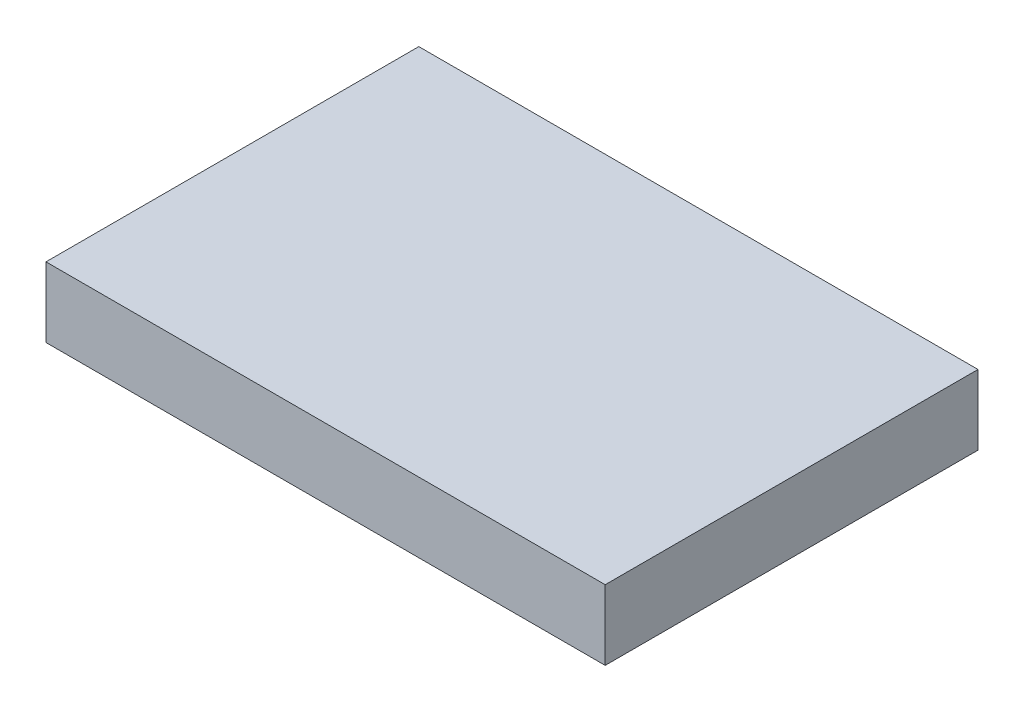
ISO-10303-21;
HEADER;
FILE_DESCRIPTION(('STEP AP214'),'2;1');
FILE_NAME('part.step','',(''),(''),'','','');
FILE_SCHEMA(('AUTOMOTIVE_DESIGN { 1 0 10303 214 1 1 1 1 }'));
ENDSEC;
DATA;
#1=APPLICATION_CONTEXT('core data for automotive mechanical design processes');
#2=APPLICATION_PROTOCOL_DEFINITION('international standard','automotive_design',2000,#1);
#3=PRODUCT_CONTEXT('',#1,'mechanical');
#4=PRODUCT('Part','Part','',(#3));
#5=PRODUCT_RELATED_PRODUCT_CATEGORY('part','',(#4));
#6=PRODUCT_DEFINITION_FORMATION('','',#4);
#7=PRODUCT_DEFINITION_CONTEXT('part definition',#1,'design');
#8=PRODUCT_DEFINITION('design','',#6,#7);
#9=PRODUCT_DEFINITION_SHAPE('','',#8);
#10=(LENGTH_UNIT() NAMED_UNIT(*) SI_UNIT(.MILLI.,.METRE.));
#11=(NAMED_UNIT(*) PLANE_ANGLE_UNIT() SI_UNIT($,.RADIAN.));
#12=(NAMED_UNIT(*) SI_UNIT($,.STERADIAN.) SOLID_ANGLE_UNIT());
#13=UNCERTAINTY_MEASURE_WITH_UNIT(LENGTH_MEASURE(1.E-05),#10,'distance_accuracy_value','');
#14=(GEOMETRIC_REPRESENTATION_CONTEXT(3) GLOBAL_UNCERTAINTY_ASSIGNED_CONTEXT((#13)) GLOBAL_UNIT_ASSIGNED_CONTEXT((#10,
#11,#12)) REPRESENTATION_CONTEXT('',''));
#15=CARTESIAN_POINT('',(0.,0.,0.));
#16=DIRECTION('',(0.,0.,1.));
#17=DIRECTION('',(1.,0.,0.));
#18=AXIS2_PLACEMENT_3D('',#15,#16,#17);
#19=CARTESIAN_POINT('',(-60.,-15.,40.));
#20=DIRECTION('',(-1.,0.,0.));
#21=DIRECTION('',(0.,0.,1.));
#22=AXIS2_PLACEMENT_3D('',#19,#20,#21);
#23=PLANE('',#22);
#24=DIRECTION('',(0.,0.,1.));
#25=VECTOR('',#24,1.);
#26=CARTESIAN_POINT('',(-60.,0.,40.));
#27=LINE('',#26,#25);
#28=CARTESIAN_POINT('',(-60.,0.,-40.));
#29=VERTEX_POINT('',#28);
#30=CARTESIAN_POINT('',(-60.,0.,40.));
#31=VERTEX_POINT('',#30);
#32=EDGE_CURVE('E103',#29,#31,#27,.T.);
#33=ORIENTED_EDGE('',*,*,#32,.F.);
#34=DIRECTION('',(0.,1.,0.));
#35=VECTOR('',#34,1.);
#36=CARTESIAN_POINT('',(-60.,-15.,-40.));
#37=LINE('',#36,#35);
#38=CARTESIAN_POINT('',(-60.,-15.,-40.));
#39=VERTEX_POINT('',#38);
#40=EDGE_CURVE('E11',#39,#29,#37,.T.);
#41=ORIENTED_EDGE('',*,*,#40,.F.);
#42=DIRECTION('',(0.,0.,1.));
#43=VECTOR('',#42,1.);
#44=CARTESIAN_POINT('',(-60.,-15.,40.));
#45=LINE('',#44,#43);
#46=CARTESIAN_POINT('',(-60.,-15.,40.));
#47=VERTEX_POINT('',#46);
#48=EDGE_CURVE('E100',#39,#47,#45,.T.);
#49=ORIENTED_EDGE('',*,*,#48,.T.);
#50=DIRECTION('',(0.,1.,0.));
#51=VECTOR('',#50,1.);
#52=CARTESIAN_POINT('',(-60.,-15.,40.));
#53=LINE('',#52,#51);
#54=EDGE_CURVE('E45',#47,#31,#53,.T.);
#55=ORIENTED_EDGE('',*,*,#54,.T.);
#56=EDGE_LOOP('',(#33,#41,#49,#55));
#57=FACE_BOUND('',#56,.T.);
#58=ADVANCED_FACE('F39',(#57),#23,.T.);
#59=CARTESIAN_POINT('',(-60.,-15.,-40.));
#60=DIRECTION('',(0.,0.,-1.));
#61=DIRECTION('',(-1.,0.,0.));
#62=AXIS2_PLACEMENT_3D('',#59,#60,#61);
#63=PLANE('',#62);
#64=DIRECTION('',(-1.,0.,0.));
#65=VECTOR('',#64,1.);
#66=CARTESIAN_POINT('',(-60.,0.,-40.));
#67=LINE('',#66,#65);
#68=CARTESIAN_POINT('',(60.,0.,-40.));
#69=VERTEX_POINT('',#68);
#70=EDGE_CURVE('E97',#69,#29,#67,.T.);
#71=ORIENTED_EDGE('',*,*,#70,.F.);
#72=DIRECTION('',(0.,1.,0.));
#73=VECTOR('',#72,1.);
#74=CARTESIAN_POINT('',(60.,-15.,-40.));
#75=LINE('',#74,#73);
#76=CARTESIAN_POINT('',(60.,-15.,-40.));
#77=VERTEX_POINT('',#76);
#78=EDGE_CURVE('E48',#77,#69,#75,.T.);
#79=ORIENTED_EDGE('',*,*,#78,.F.);
#80=DIRECTION('',(-1.,0.,0.));
#81=VECTOR('',#80,1.);
#82=CARTESIAN_POINT('',(-60.,-15.,-40.));
#83=LINE('',#82,#81);
#84=EDGE_CURVE('E94',#77,#39,#83,.T.);
#85=ORIENTED_EDGE('',*,*,#84,.T.);
#86=ORIENTED_EDGE('',*,*,#40,.T.);
#87=EDGE_LOOP('',(#71,#79,#85,#86));
#88=FACE_BOUND('',#87,.T.);
#89=ADVANCED_FACE('F114',(#88),#63,.T.);
#90=CARTESIAN_POINT('',(60.,-15.,40.));
#91=DIRECTION('',(1.,0.,0.));
#92=DIRECTION('',(0.,0.,-1.));
#93=AXIS2_PLACEMENT_3D('',#90,#91,#92);
#94=PLANE('',#93);
#95=DIRECTION('',(0.,0.,-1.));
#96=VECTOR('',#95,1.);
#97=CARTESIAN_POINT('',(60.,0.,40.));
#98=LINE('',#97,#96);
#99=CARTESIAN_POINT('',(60.,0.,40.));
#100=VERTEX_POINT('',#99);
#101=EDGE_CURVE('E90',#100,#69,#98,.T.);
#102=ORIENTED_EDGE('',*,*,#101,.F.);
#103=DIRECTION('',(0.,1.,0.));
#104=VECTOR('',#103,1.);
#105=CARTESIAN_POINT('',(60.,-15.,40.));
#106=LINE('',#105,#104);
#107=CARTESIAN_POINT('',(60.,-15.,40.));
#108=VERTEX_POINT('',#107);
#109=EDGE_CURVE('E81',#108,#100,#106,.T.);
#110=ORIENTED_EDGE('',*,*,#109,.F.);
#111=DIRECTION('',(0.,0.,-1.));
#112=VECTOR('',#111,1.);
#113=CARTESIAN_POINT('',(60.,-15.,40.));
#114=LINE('',#113,#112);
#115=EDGE_CURVE('E87',#108,#77,#114,.T.);
#116=ORIENTED_EDGE('',*,*,#115,.T.);
#117=ORIENTED_EDGE('',*,*,#78,.T.);
#118=EDGE_LOOP('',(#102,#110,#116,#117));
#119=FACE_BOUND('',#118,.T.);
#120=ADVANCED_FACE('F88',(#119),#94,.T.);
#121=CARTESIAN_POINT('',(-60.,-15.,40.));
#122=DIRECTION('',(0.,0.,1.));
#123=DIRECTION('',(1.,0.,0.));
#124=AXIS2_PLACEMENT_3D('',#121,#122,#123);
#125=PLANE('',#124);
#126=DIRECTION('',(1.,0.,0.));
#127=VECTOR('',#126,1.);
#128=CARTESIAN_POINT('',(-60.,0.,40.));
#129=LINE('',#128,#127);
#130=EDGE_CURVE('E106',#31,#100,#129,.T.);
#131=ORIENTED_EDGE('',*,*,#130,.F.);
#132=ORIENTED_EDGE('',*,*,#54,.F.);
#133=DIRECTION('',(1.,0.,0.));
#134=VECTOR('',#133,1.);
#135=CARTESIAN_POINT('',(-60.,-15.,40.));
#136=LINE('',#135,#134);
#137=EDGE_CURVE('E91',#47,#108,#136,.T.);
#138=ORIENTED_EDGE('',*,*,#137,.T.);
#139=ORIENTED_EDGE('',*,*,#109,.T.);
#140=EDGE_LOOP('',(#131,#132,#138,#139));
#141=FACE_BOUND('',#140,.T.);
#142=ADVANCED_FACE('F96',(#141),#125,.T.);
#143=CARTESIAN_POINT('',(0.,-15.,0.));
#144=DIRECTION('',(0.,-1.,0.));
#145=DIRECTION('',(0.,0.,-1.));
#146=AXIS2_PLACEMENT_3D('',#143,#144,#145);
#147=PLANE('',#146);
#148=ORIENTED_EDGE('',*,*,#48,.F.);
#149=ORIENTED_EDGE('',*,*,#84,.F.);
#150=ORIENTED_EDGE('',*,*,#115,.F.);
#151=ORIENTED_EDGE('',*,*,#137,.F.);
#152=EDGE_LOOP('',(#148,#149,#150,#151));
#153=FACE_BOUND('',#152,.T.);
#154=ADVANCED_FACE('F95',(#153),#147,.T.);
#155=CARTESIAN_POINT('',(0.,0.,0.));
#156=DIRECTION('',(0.,-1.,0.));
#157=DIRECTION('',(0.,0.,-1.));
#158=AXIS2_PLACEMENT_3D('',#155,#156,#157);
#159=PLANE('',#158);
#160=ORIENTED_EDGE('',*,*,#32,.T.);
#161=ORIENTED_EDGE('',*,*,#130,.T.);
#162=ORIENTED_EDGE('',*,*,#101,.T.);
#163=ORIENTED_EDGE('',*,*,#70,.T.);
#164=EDGE_LOOP('',(#160,#161,#162,#163));
#165=FACE_BOUND('',#164,.T.);
#166=ADVANCED_FACE('F115',(#165),#159,.F.);
#167=CLOSED_SHELL('',(#58,#89,#120,#142,#154,#166));
#168=MANIFOLD_SOLID_BREP('B2',#167);
#169=ADVANCED_BREP_SHAPE_REPRESENTATION('',(#18,#168),#14);
#170=SHAPE_DEFINITION_REPRESENTATION(#9,#169);
ENDSEC;
END-ISO-10303-21;
